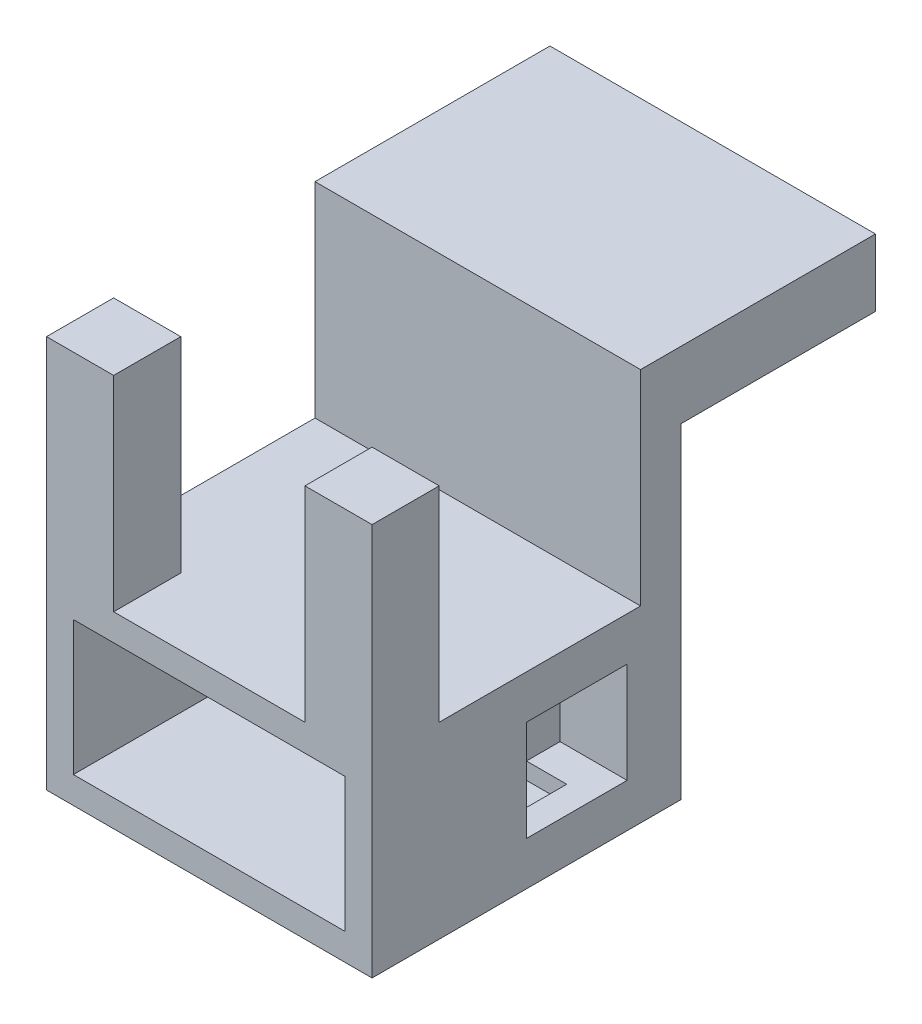
ISO-10303-21;
HEADER;
FILE_DESCRIPTION(('STEP AP214'),'2;1');
FILE_NAME('part.step','',(''),(''),'','','');
FILE_SCHEMA(('AUTOMOTIVE_DESIGN { 1 0 10303 214 1 1 1 1 }'));
ENDSEC;
DATA;
#1=APPLICATION_CONTEXT('core data for automotive mechanical design processes');
#2=APPLICATION_PROTOCOL_DEFINITION('international standard','automotive_design',2000,#1);
#3=PRODUCT_CONTEXT('',#1,'mechanical');
#4=PRODUCT('Part','Part','',(#3));
#5=PRODUCT_RELATED_PRODUCT_CATEGORY('part','',(#4));
#6=PRODUCT_DEFINITION_FORMATION('','',#4);
#7=PRODUCT_DEFINITION_CONTEXT('part definition',#1,'design');
#8=PRODUCT_DEFINITION('design','',#6,#7);
#9=PRODUCT_DEFINITION_SHAPE('','',#8);
#10=(LENGTH_UNIT() NAMED_UNIT(*) SI_UNIT(.MILLI.,.METRE.));
#11=(NAMED_UNIT(*) PLANE_ANGLE_UNIT() SI_UNIT($,.RADIAN.));
#12=(NAMED_UNIT(*) SI_UNIT($,.STERADIAN.) SOLID_ANGLE_UNIT());
#13=UNCERTAINTY_MEASURE_WITH_UNIT(LENGTH_MEASURE(1.E-05),#10,'distance_accuracy_value','');
#14=(GEOMETRIC_REPRESENTATION_CONTEXT(3) GLOBAL_UNCERTAINTY_ASSIGNED_CONTEXT((#13)) GLOBAL_UNIT_ASSIGNED_CONTEXT((#10,
#11,#12)) REPRESENTATION_CONTEXT('',''));
#15=CARTESIAN_POINT('',(0.,0.,0.));
#16=DIRECTION('',(0.,0.,1.));
#17=DIRECTION('',(1.,0.,0.));
#18=AXIS2_PLACEMENT_3D('',#15,#16,#17);
#19=CARTESIAN_POINT('',(-10.,10.,-57.55));
#20=DIRECTION('',(1.,0.,0.));
#21=DIRECTION('',(0.,1.,0.));
#22=AXIS2_PLACEMENT_3D('',#19,#20,#21);
#23=PLANE('',#22);
#24=DIRECTION('',(0.,0.,1.));
#25=VECTOR('',#24,1.);
#26=CARTESIAN_POINT('',(-10.,-10.,-57.55));
#27=LINE('',#26,#25);
#28=CARTESIAN_POINT('',(-10.,-10.,-50.55));
#29=VERTEX_POINT('',#28);
#30=CARTESIAN_POINT('',(-10.,-10.,-17.55));
#31=VERTEX_POINT('',#30);
#32=EDGE_CURVE('E360',#29,#31,#27,.T.);
#33=ORIENTED_EDGE('',*,*,#32,.F.);
#34=DIRECTION('',(0.,1.,0.));
#35=VECTOR('',#34,1.);
#36=CARTESIAN_POINT('',(-10.,10.,-50.55));
#37=LINE('',#36,#35);
#38=CARTESIAN_POINT('',(-10.,10.,-50.55));
#39=VERTEX_POINT('',#38);
#40=EDGE_CURVE('E345',#29,#39,#37,.T.);
#41=ORIENTED_EDGE('',*,*,#40,.T.);
#42=DIRECTION('',(0.,0.,1.));
#43=VECTOR('',#42,1.);
#44=CARTESIAN_POINT('',(-10.,10.,-57.55));
#45=LINE('',#44,#43);
#46=CARTESIAN_POINT('',(-10.,10.,-17.55));
#47=VERTEX_POINT('',#46);
#48=EDGE_CURVE('E220',#39,#47,#45,.T.);
#49=ORIENTED_EDGE('',*,*,#48,.T.);
#50=DIRECTION('',(0.,1.,0.));
#51=VECTOR('',#50,1.);
#52=CARTESIAN_POINT('',(-10.,10.,-17.55));
#53=LINE('',#52,#51);
#54=EDGE_CURVE('E348',#31,#47,#53,.T.);
#55=ORIENTED_EDGE('',*,*,#54,.F.);
#56=EDGE_LOOP('',(#33,#41,#49,#55));
#57=FACE_BOUND('',#56,.T.);
#58=ADVANCED_FACE('F47',(#57),#23,.T.);
#59=CARTESIAN_POINT('',(30.5,10.,-57.55));
#60=DIRECTION('',(0.,-1.,0.));
#61=DIRECTION('',(0.,0.,-1.));
#62=AXIS2_PLACEMENT_3D('',#59,#60,#61);
#63=PLANE('',#62);
#64=ORIENTED_EDGE('',*,*,#48,.F.);
#65=DIRECTION('',(1.,0.,0.));
#66=VECTOR('',#65,1.);
#67=CARTESIAN_POINT('',(30.5,10.,-50.55));
#68=LINE('',#67,#66);
#69=CARTESIAN_POINT('',(30.5,10.,-50.55));
#70=VERTEX_POINT('',#69);
#71=EDGE_CURVE('E342',#39,#70,#68,.T.);
#72=ORIENTED_EDGE('',*,*,#71,.T.);
#73=DIRECTION('',(0.,0.,1.));
#74=VECTOR('',#73,1.);
#75=CARTESIAN_POINT('',(30.5,10.,-57.55));
#76=LINE('',#75,#74);
#77=CARTESIAN_POINT('',(30.5,10.,-17.55));
#78=VERTEX_POINT('',#77);
#79=EDGE_CURVE('E364',#70,#78,#76,.T.);
#80=ORIENTED_EDGE('',*,*,#79,.T.);
#81=DIRECTION('',(1.,0.,0.));
#82=VECTOR('',#81,1.);
#83=CARTESIAN_POINT('',(30.5,10.,-17.55));
#84=LINE('',#83,#82);
#85=EDGE_CURVE('E351',#47,#78,#84,.T.);
#86=ORIENTED_EDGE('',*,*,#85,.F.);
#87=EDGE_LOOP('',(#64,#72,#80,#86));
#88=FACE_BOUND('',#87,.T.);
#89=ADVANCED_FACE('F406',(#88),#63,.T.);
#90=CARTESIAN_POINT('',(30.5,10.,-57.55));
#91=DIRECTION('',(-1.,0.,0.));
#92=DIRECTION('',(0.,-1.,0.));
#93=AXIS2_PLACEMENT_3D('',#90,#91,#92);
#94=PLANE('',#93);
#95=DIRECTION('',(0.,0.,-1.));
#96=VECTOR('',#95,1.);
#97=CARTESIAN_POINT('',(30.5,7.5,-57.55));
#98=LINE('',#97,#96);
#99=CARTESIAN_POINT('',(30.5,7.5,-40.55));
#100=VERTEX_POINT('',#99);
#101=CARTESIAN_POINT('',(30.5,7.5,-50.55));
#102=VERTEX_POINT('',#101);
#103=EDGE_CURVE('E334',#100,#102,#98,.T.);
#104=ORIENTED_EDGE('',*,*,#103,.F.);
#105=DIRECTION('',(0.,1.,0.));
#106=VECTOR('',#105,1.);
#107=CARTESIAN_POINT('',(30.5,10.,-40.55));
#108=LINE('',#107,#106);
#109=CARTESIAN_POINT('',(30.5,-7.5,-40.55));
#110=VERTEX_POINT('',#109);
#111=EDGE_CURVE('E336',#110,#100,#108,.T.);
#112=ORIENTED_EDGE('',*,*,#111,.F.);
#113=DIRECTION('',(0.,0.,1.));
#114=VECTOR('',#113,1.);
#115=CARTESIAN_POINT('',(30.5,-7.5,-57.55));
#116=LINE('',#115,#114);
#117=CARTESIAN_POINT('',(30.5,-7.5,-50.55));
#118=VERTEX_POINT('',#117);
#119=EDGE_CURVE('E326',#118,#110,#116,.T.);
#120=ORIENTED_EDGE('',*,*,#119,.F.);
#121=DIRECTION('',(0.,-1.,0.));
#122=VECTOR('',#121,1.);
#123=CARTESIAN_POINT('',(30.5,10.,-50.55));
#124=LINE('',#123,#122);
#125=CARTESIAN_POINT('',(30.5,-10.,-50.55));
#126=VERTEX_POINT('',#125);
#127=EDGE_CURVE('E338',#118,#126,#124,.T.);
#128=ORIENTED_EDGE('',*,*,#127,.T.);
#129=DIRECTION('',(0.,0.,1.));
#130=VECTOR('',#129,1.);
#131=CARTESIAN_POINT('',(30.5,-10.,-57.55));
#132=LINE('',#131,#130);
#133=CARTESIAN_POINT('',(30.5,-10.,-17.55));
#134=VERTEX_POINT('',#133);
#135=EDGE_CURVE('E362',#126,#134,#132,.T.);
#136=ORIENTED_EDGE('',*,*,#135,.T.);
#137=DIRECTION('',(0.,-1.,0.));
#138=VECTOR('',#137,1.);
#139=CARTESIAN_POINT('',(30.5,10.,-17.55));
#140=LINE('',#139,#138);
#141=EDGE_CURVE('E354',#78,#134,#140,.T.);
#142=ORIENTED_EDGE('',*,*,#141,.F.);
#143=ORIENTED_EDGE('',*,*,#79,.F.);
#144=EDGE_CURVE('E339',#70,#102,#124,.T.);
#145=ORIENTED_EDGE('',*,*,#144,.T.);
#146=EDGE_LOOP('',(#104,#112,#120,#128,#136,#142,#143,#145));
#147=FACE_BOUND('',#146,.T.);
#148=ADVANCED_FACE('F400',(#147),#94,.T.);
#149=CARTESIAN_POINT('',(30.5,-10.,-57.55));
#150=DIRECTION('',(0.,1.,0.));
#151=DIRECTION('',(0.,0.,1.));
#152=AXIS2_PLACEMENT_3D('',#149,#150,#151);
#153=PLANE('',#152);
#154=ORIENTED_EDGE('',*,*,#135,.F.);
#155=DIRECTION('',(-1.,0.,0.));
#156=VECTOR('',#155,1.);
#157=CARTESIAN_POINT('',(30.5,-10.,-50.55));
#158=LINE('',#157,#156);
#159=EDGE_CURVE('E383',#126,#29,#158,.T.);
#160=ORIENTED_EDGE('',*,*,#159,.T.);
#161=ORIENTED_EDGE('',*,*,#32,.T.);
#162=DIRECTION('',(-1.,0.,0.));
#163=VECTOR('',#162,1.);
#164=CARTESIAN_POINT('',(30.5,-10.,-17.55));
#165=LINE('',#164,#163);
#166=EDGE_CURVE('E357',#134,#31,#165,.T.);
#167=ORIENTED_EDGE('',*,*,#166,.F.);
#168=EDGE_LOOP('',(#154,#160,#161,#167));
#169=FACE_BOUND('',#168,.T.);
#170=ADVANCED_FACE('F414',(#169),#153,.T.);
#171=CARTESIAN_POINT('',(0.,0.,-17.55));
#172=DIRECTION('',(0.,0.,-1.));
#173=DIRECTION('',(-1.,0.,0.));
#174=AXIS2_PLACEMENT_3D('',#171,#172,#173);
#175=PLANE('',#174);
#176=DIRECTION('',(0.,-1.,0.));
#177=VECTOR('',#176,1.);
#178=CARTESIAN_POINT('',(34.5,14.,-17.55));
#179=LINE('',#178,#177);
#180=CARTESIAN_POINT('',(34.5,44.5,-17.55));
#181=VERTEX_POINT('',#180);
#182=CARTESIAN_POINT('',(34.5,-14.,-17.55));
#183=VERTEX_POINT('',#182);
#184=EDGE_CURVE('E209',#181,#183,#179,.T.);
#185=ORIENTED_EDGE('',*,*,#184,.F.);
#186=DIRECTION('',(-1.,0.,0.));
#187=VECTOR('',#186,1.);
#188=CARTESIAN_POINT('',(34.5,44.5,-17.55));
#189=LINE('',#188,#187);
#190=CARTESIAN_POINT('',(24.5,44.5,-17.55));
#191=VERTEX_POINT('',#190);
#192=EDGE_CURVE('E213',#181,#191,#189,.T.);
#193=ORIENTED_EDGE('',*,*,#192,.T.);
#194=DIRECTION('',(0.,-1.,0.));
#195=VECTOR('',#194,1.);
#196=CARTESIAN_POINT('',(24.5,58.642135623731,-17.55));
#197=LINE('',#196,#195);
#198=CARTESIAN_POINT('',(24.5,14.,-17.55));
#199=VERTEX_POINT('',#198);
#200=EDGE_CURVE('E230',#191,#199,#197,.T.);
#201=ORIENTED_EDGE('',*,*,#200,.T.);
#202=DIRECTION('',(1.,0.,0.));
#203=VECTOR('',#202,1.);
#204=CARTESIAN_POINT('',(34.5,14.,-17.55));
#205=LINE('',#204,#203);
#206=CARTESIAN_POINT('',(-3.99999999999999,14.,-17.55));
#207=VERTEX_POINT('',#206);
#208=EDGE_CURVE('E370',#207,#199,#205,.T.);
#209=ORIENTED_EDGE('',*,*,#208,.F.);
#210=DIRECTION('',(0.,-1.,0.));
#211=VECTOR('',#210,1.);
#212=CARTESIAN_POINT('',(-4.,58.642135623731,-17.55));
#213=LINE('',#212,#211);
#214=CARTESIAN_POINT('',(-4.,44.5,-17.55));
#215=VERTEX_POINT('',#214);
#216=EDGE_CURVE('E259',#215,#207,#213,.T.);
#217=ORIENTED_EDGE('',*,*,#216,.F.);
#218=DIRECTION('',(-1.,0.,0.));
#219=VECTOR('',#218,1.);
#220=CARTESIAN_POINT('',(-14.,44.5,-17.55));
#221=LINE('',#220,#219);
#222=CARTESIAN_POINT('',(-14.,44.5,-17.55));
#223=VERTEX_POINT('',#222);
#224=EDGE_CURVE('E256',#215,#223,#221,.T.);
#225=ORIENTED_EDGE('',*,*,#224,.T.);
#226=DIRECTION('',(0.,1.,0.));
#227=VECTOR('',#226,1.);
#228=CARTESIAN_POINT('',(-14.,14.,-17.55));
#229=LINE('',#228,#227);
#230=CARTESIAN_POINT('',(-14.,-14.,-17.55));
#231=VERTEX_POINT('',#230);
#232=EDGE_CURVE('E373',#231,#223,#229,.T.);
#233=ORIENTED_EDGE('',*,*,#232,.F.);
#234=DIRECTION('',(-1.,0.,0.));
#235=VECTOR('',#234,1.);
#236=CARTESIAN_POINT('',(34.5,-14.,-17.55));
#237=LINE('',#236,#235);
#238=EDGE_CURVE('E216',#183,#231,#237,.T.);
#239=ORIENTED_EDGE('',*,*,#238,.F.);
#240=EDGE_LOOP('',(#185,#193,#201,#209,#217,#225,#233,#239));
#241=FACE_BOUND('',#240,.T.);
#242=ORIENTED_EDGE('',*,*,#54,.T.);
#243=ORIENTED_EDGE('',*,*,#85,.T.);
#244=ORIENTED_EDGE('',*,*,#141,.T.);
#245=ORIENTED_EDGE('',*,*,#166,.T.);
#246=EDGE_LOOP('',(#242,#243,#244,#245));
#247=FACE_BOUND('',#246,.T.);
#248=ADVANCED_FACE('F211',(#241,#247),#175,.F.);
#249=CARTESIAN_POINT('',(34.5,14.,-57.55));
#250=DIRECTION('',(-1.,0.,0.));
#251=DIRECTION('',(0.,0.,1.));
#252=AXIS2_PLACEMENT_3D('',#249,#250,#251);
#253=PLANE('',#252);
#254=DIRECTION('',(0.,0.,-1.));
#255=VECTOR('',#254,1.);
#256=CARTESIAN_POINT('',(34.5,-7.5,-40.55));
#257=LINE('',#256,#255);
#258=CARTESIAN_POINT('',(34.5,-7.5,-40.55));
#259=VERTEX_POINT('',#258);
#260=CARTESIAN_POINT('',(34.5,-7.5,-55.55));
#261=VERTEX_POINT('',#260);
#262=EDGE_CURVE('E316',#259,#261,#257,.T.);
#263=ORIENTED_EDGE('',*,*,#262,.F.);
#264=DIRECTION('',(0.,-1.,0.));
#265=VECTOR('',#264,1.);
#266=CARTESIAN_POINT('',(34.5,7.5,-40.55));
#267=LINE('',#266,#265);
#268=CARTESIAN_POINT('',(34.5,7.5,-40.55));
#269=VERTEX_POINT('',#268);
#270=EDGE_CURVE('E305',#269,#259,#267,.T.);
#271=ORIENTED_EDGE('',*,*,#270,.F.);
#272=DIRECTION('',(0.,0.,1.));
#273=VECTOR('',#272,1.);
#274=CARTESIAN_POINT('',(34.5,7.5,-40.55));
#275=LINE('',#274,#273);
#276=CARTESIAN_POINT('',(34.5,7.5,-55.55));
#277=VERTEX_POINT('',#276);
#278=EDGE_CURVE('E309',#277,#269,#275,.T.);
#279=ORIENTED_EDGE('',*,*,#278,.F.);
#280=DIRECTION('',(0.,1.,0.));
#281=VECTOR('',#280,1.);
#282=CARTESIAN_POINT('',(34.5,7.5,-55.55));
#283=LINE('',#282,#281);
#284=EDGE_CURVE('E319',#261,#277,#283,.T.);
#285=ORIENTED_EDGE('',*,*,#284,.F.);
#286=EDGE_LOOP('',(#263,#271,#279,#285));
#287=FACE_BOUND('',#286,.T.);
#288=DIRECTION('',(0.,-1.,0.));
#289=VECTOR('',#288,1.);
#290=CARTESIAN_POINT('',(34.5,0.,-63.55));
#291=LINE('',#290,#289);
#292=CARTESIAN_POINT('',(34.5,34.5,-63.55));
#293=VERTEX_POINT('',#292);
#294=CARTESIAN_POINT('',(34.5,-14.,-63.55));
#295=VERTEX_POINT('',#294);
#296=EDGE_CURVE('E289',#293,#295,#291,.T.);
#297=ORIENTED_EDGE('',*,*,#296,.F.);
#298=DIRECTION('',(0.,0.,1.));
#299=VECTOR('',#298,1.);
#300=CARTESIAN_POINT('',(34.5,34.5,-92.55));
#301=LINE('',#300,#299);
#302=CARTESIAN_POINT('',(34.5,34.5,-92.55));
#303=VERTEX_POINT('',#302);
#304=EDGE_CURVE('E280',#303,#293,#301,.T.);
#305=ORIENTED_EDGE('',*,*,#304,.F.);
#306=DIRECTION('',(0.,1.,0.));
#307=VECTOR('',#306,1.);
#308=CARTESIAN_POINT('',(34.5,0.,-92.55));
#309=LINE('',#308,#307);
#310=CARTESIAN_POINT('',(34.5,44.5,-92.55));
#311=VERTEX_POINT('',#310);
#312=EDGE_CURVE('E277',#303,#311,#309,.T.);
#313=ORIENTED_EDGE('',*,*,#312,.T.);
#314=DIRECTION('',(0.,0.,1.));
#315=VECTOR('',#314,1.);
#316=CARTESIAN_POINT('',(34.5,44.5,-63.55));
#317=LINE('',#316,#315);
#318=CARTESIAN_POINT('',(34.5,44.5,-57.55));
#319=VERTEX_POINT('',#318);
#320=EDGE_CURVE('E295',#311,#319,#317,.T.);
#321=ORIENTED_EDGE('',*,*,#320,.T.);
#322=DIRECTION('',(0.,-1.,0.));
#323=VECTOR('',#322,1.);
#324=CARTESIAN_POINT('',(34.5,0.,-57.55));
#325=LINE('',#324,#323);
#326=CARTESIAN_POINT('',(34.5,14.,-57.55));
#327=VERTEX_POINT('',#326);
#328=EDGE_CURVE('E290',#319,#327,#325,.T.);
#329=ORIENTED_EDGE('',*,*,#328,.T.);
#330=DIRECTION('',(0.,0.,1.));
#331=VECTOR('',#330,1.);
#332=CARTESIAN_POINT('',(34.5,14.,-57.55));
#333=LINE('',#332,#331);
#334=CARTESIAN_POINT('',(34.5,14.,-27.55));
#335=VERTEX_POINT('',#334);
#336=EDGE_CURVE('E369',#327,#335,#333,.T.);
#337=ORIENTED_EDGE('',*,*,#336,.T.);
#338=DIRECTION('',(0.,-1.,0.));
#339=VECTOR('',#338,1.);
#340=CARTESIAN_POINT('',(34.5,58.642135623731,-27.55));
#341=LINE('',#340,#339);
#342=CARTESIAN_POINT('',(34.5,44.5,-27.55));
#343=VERTEX_POINT('',#342);
#344=EDGE_CURVE('E233',#343,#335,#341,.T.);
#345=ORIENTED_EDGE('',*,*,#344,.F.);
#346=DIRECTION('',(0.,0.,1.));
#347=VECTOR('',#346,1.);
#348=CARTESIAN_POINT('',(34.5,44.5,-17.55));
#349=LINE('',#348,#347);
#350=EDGE_CURVE('E224',#343,#181,#349,.T.);
#351=ORIENTED_EDGE('',*,*,#350,.T.);
#352=ORIENTED_EDGE('',*,*,#184,.T.);
#353=DIRECTION('',(0.,0.,1.));
#354=VECTOR('',#353,1.);
#355=CARTESIAN_POINT('',(34.5,-14.,-57.55));
#356=LINE('',#355,#354);
#357=EDGE_CURVE('E381',#295,#183,#356,.T.);
#358=ORIENTED_EDGE('',*,*,#357,.F.);
#359=EDGE_LOOP('',(#297,#305,#313,#321,#329,#337,#345,#351,#352,#358));
#360=FACE_BOUND('',#359,.T.);
#361=ADVANCED_FACE('F49',(#287,#360),#253,.F.);
#362=CARTESIAN_POINT('',(34.5,-14.,-57.55));
#363=DIRECTION('',(0.,1.,0.));
#364=DIRECTION('',(-1.,0.,0.));
#365=AXIS2_PLACEMENT_3D('',#362,#363,#364);
#366=PLANE('',#365);
#367=ORIENTED_EDGE('',*,*,#357,.T.);
#368=ORIENTED_EDGE('',*,*,#238,.T.);
#369=DIRECTION('',(0.,0.,1.));
#370=VECTOR('',#369,1.);
#371=CARTESIAN_POINT('',(-14.,-14.,-57.55));
#372=LINE('',#371,#370);
#373=CARTESIAN_POINT('',(-14.,-14.,-63.55));
#374=VERTEX_POINT('',#373);
#375=EDGE_CURVE('E379',#374,#231,#372,.T.);
#376=ORIENTED_EDGE('',*,*,#375,.F.);
#377=DIRECTION('',(-1.,0.,0.));
#378=VECTOR('',#377,1.);
#379=CARTESIAN_POINT('',(0.,-14.,-63.55));
#380=LINE('',#379,#378);
#381=EDGE_CURVE('E292',#295,#374,#380,.T.);
#382=ORIENTED_EDGE('',*,*,#381,.F.);
#383=EDGE_LOOP('',(#367,#368,#376,#382));
#384=FACE_BOUND('',#383,.T.);
#385=ADVANCED_FACE('F460',(#384),#366,.F.);
#386=CARTESIAN_POINT('',(-14.,14.,-57.55));
#387=DIRECTION('',(1.,0.,0.));
#388=DIRECTION('',(0.,1.,0.));
#389=AXIS2_PLACEMENT_3D('',#386,#387,#388);
#390=PLANE('',#389);
#391=DIRECTION('',(0.,1.,0.));
#392=VECTOR('',#391,1.);
#393=CARTESIAN_POINT('',(-14.,0.,-57.55));
#394=LINE('',#393,#392);
#395=CARTESIAN_POINT('',(-14.,14.,-57.55));
#396=VERTEX_POINT('',#395);
#397=CARTESIAN_POINT('',(-14.,44.5,-57.55));
#398=VERTEX_POINT('',#397);
#399=EDGE_CURVE('E286',#396,#398,#394,.T.);
#400=ORIENTED_EDGE('',*,*,#399,.T.);
#401=DIRECTION('',(0.,0.,1.));
#402=VECTOR('',#401,1.);
#403=CARTESIAN_POINT('',(-14.,44.5,-63.55));
#404=LINE('',#403,#402);
#405=CARTESIAN_POINT('',(-14.,44.5,-92.55));
#406=VERTEX_POINT('',#405);
#407=EDGE_CURVE('E302',#406,#398,#404,.T.);
#408=ORIENTED_EDGE('',*,*,#407,.F.);
#409=DIRECTION('',(0.,1.,0.));
#410=VECTOR('',#409,1.);
#411=CARTESIAN_POINT('',(-14.,0.,-92.55));
#412=LINE('',#411,#410);
#413=CARTESIAN_POINT('',(-14.,34.5,-92.55));
#414=VERTEX_POINT('',#413);
#415=EDGE_CURVE('E271',#414,#406,#412,.T.);
#416=ORIENTED_EDGE('',*,*,#415,.F.);
#417=DIRECTION('',(0.,0.,1.));
#418=VECTOR('',#417,1.);
#419=CARTESIAN_POINT('',(-14.,34.5,-92.55));
#420=LINE('',#419,#418);
#421=CARTESIAN_POINT('',(-14.,34.5,-63.55));
#422=VERTEX_POINT('',#421);
#423=EDGE_CURVE('E283',#414,#422,#420,.T.);
#424=ORIENTED_EDGE('',*,*,#423,.T.);
#425=DIRECTION('',(0.,1.,0.));
#426=VECTOR('',#425,1.);
#427=CARTESIAN_POINT('',(-14.,0.,-63.55));
#428=LINE('',#427,#426);
#429=EDGE_CURVE('E287',#374,#422,#428,.T.);
#430=ORIENTED_EDGE('',*,*,#429,.F.);
#431=ORIENTED_EDGE('',*,*,#375,.T.);
#432=ORIENTED_EDGE('',*,*,#232,.T.);
#433=DIRECTION('',(0.,0.,-1.));
#434=VECTOR('',#433,1.);
#435=CARTESIAN_POINT('',(-14.,44.5,-17.55));
#436=LINE('',#435,#434);
#437=CARTESIAN_POINT('',(-14.,44.5,-27.55));
#438=VERTEX_POINT('',#437);
#439=EDGE_CURVE('E252',#223,#438,#436,.T.);
#440=ORIENTED_EDGE('',*,*,#439,.T.);
#441=DIRECTION('',(0.,-1.,0.));
#442=VECTOR('',#441,1.);
#443=CARTESIAN_POINT('',(-14.,58.642135623731,-27.55));
#444=LINE('',#443,#442);
#445=CARTESIAN_POINT('',(-14.,14.,-27.55));
#446=VERTEX_POINT('',#445);
#447=EDGE_CURVE('E255',#438,#446,#444,.T.);
#448=ORIENTED_EDGE('',*,*,#447,.T.);
#449=DIRECTION('',(0.,0.,1.));
#450=VECTOR('',#449,1.);
#451=CARTESIAN_POINT('',(-14.,14.,-57.55));
#452=LINE('',#451,#450);
#453=EDGE_CURVE('E377',#396,#446,#452,.T.);
#454=ORIENTED_EDGE('',*,*,#453,.F.);
#455=EDGE_LOOP('',(#400,#408,#416,#424,#430,#431,#432,#440,#448,#454));
#456=FACE_BOUND('',#455,.T.);
#457=ADVANCED_FACE('F458',(#456),#390,.F.);
#458=CARTESIAN_POINT('',(34.5,14.,-57.55));
#459=DIRECTION('',(0.,-1.,0.));
#460=DIRECTION('',(0.,0.,-1.));
#461=AXIS2_PLACEMENT_3D('',#458,#459,#460);
#462=PLANE('',#461);
#463=ORIENTED_EDGE('',*,*,#208,.T.);
#464=DIRECTION('',(0.,0.,-1.));
#465=VECTOR('',#464,1.);
#466=CARTESIAN_POINT('',(24.5,14.,-17.55));
#467=LINE('',#466,#465);
#468=CARTESIAN_POINT('',(24.5,14.,-27.55));
#469=VERTEX_POINT('',#468);
#470=EDGE_CURVE('E241',#199,#469,#467,.T.);
#471=ORIENTED_EDGE('',*,*,#470,.T.);
#472=DIRECTION('',(1.,0.,0.));
#473=VECTOR('',#472,1.);
#474=CARTESIAN_POINT('',(34.5,14.,-27.55));
#475=LINE('',#474,#473);
#476=EDGE_CURVE('E229',#469,#335,#475,.T.);
#477=ORIENTED_EDGE('',*,*,#476,.T.);
#478=ORIENTED_EDGE('',*,*,#336,.F.);
#479=DIRECTION('',(1.,0.,0.));
#480=VECTOR('',#479,1.);
#481=CARTESIAN_POINT('',(34.5,14.,-57.55));
#482=LINE('',#481,#480);
#483=EDGE_CURVE('E367',#396,#327,#482,.T.);
#484=ORIENTED_EDGE('',*,*,#483,.F.);
#485=ORIENTED_EDGE('',*,*,#453,.T.);
#486=DIRECTION('',(1.,0.,0.));
#487=VECTOR('',#486,1.);
#488=CARTESIAN_POINT('',(-14.,14.,-27.55));
#489=LINE('',#488,#487);
#490=CARTESIAN_POINT('',(-4.,14.,-27.55));
#491=VERTEX_POINT('',#490);
#492=EDGE_CURVE('E62',#446,#491,#489,.T.);
#493=ORIENTED_EDGE('',*,*,#492,.T.);
#494=DIRECTION('',(0.,0.,1.));
#495=VECTOR('',#494,1.);
#496=CARTESIAN_POINT('',(-4.,14.,-17.55));
#497=LINE('',#496,#495);
#498=EDGE_CURVE('E67',#491,#207,#497,.T.);
#499=ORIENTED_EDGE('',*,*,#498,.T.);
#500=EDGE_LOOP('',(#463,#471,#477,#478,#484,#485,#493,#499));
#501=FACE_BOUND('',#500,.T.);
#502=ADVANCED_FACE('F455',(#501),#462,.F.);
#503=CARTESIAN_POINT('',(0.,0.,-50.55));
#504=DIRECTION('',(0.,0.,-1.));
#505=DIRECTION('',(-1.,0.,0.));
#506=AXIS2_PLACEMENT_3D('',#503,#504,#505);
#507=PLANE('',#506);
#508=DIRECTION('',(0.,-1.,0.));
#509=VECTOR('',#508,1.);
#510=CARTESIAN_POINT('',(24.5,0.,-50.55));
#511=LINE('',#510,#509);
#512=CARTESIAN_POINT('',(24.5,7.5,-50.55));
#513=VERTEX_POINT('',#512);
#514=CARTESIAN_POINT('',(24.5,-7.5,-50.55));
#515=VERTEX_POINT('',#514);
#516=EDGE_CURVE('E386',#513,#515,#511,.T.);
#517=ORIENTED_EDGE('',*,*,#516,.F.);
#518=DIRECTION('',(1.,0.,0.));
#519=VECTOR('',#518,1.);
#520=CARTESIAN_POINT('',(0.,7.5,-50.55));
#521=LINE('',#520,#519);
#522=EDGE_CURVE('E55',#513,#102,#521,.T.);
#523=ORIENTED_EDGE('',*,*,#522,.T.);
#524=ORIENTED_EDGE('',*,*,#144,.F.);
#525=ORIENTED_EDGE('',*,*,#71,.F.);
#526=ORIENTED_EDGE('',*,*,#40,.F.);
#527=ORIENTED_EDGE('',*,*,#159,.F.);
#528=ORIENTED_EDGE('',*,*,#127,.F.);
#529=DIRECTION('',(-1.,0.,0.));
#530=VECTOR('',#529,1.);
#531=CARTESIAN_POINT('',(0.,-7.5,-50.55));
#532=LINE('',#531,#530);
#533=EDGE_CURVE('E388',#118,#515,#532,.T.);
#534=ORIENTED_EDGE('',*,*,#533,.T.);
#535=EDGE_LOOP('',(#517,#523,#524,#525,#526,#527,#528,#534));
#536=FACE_BOUND('',#535,.T.);
#537=ADVANCED_FACE('F394',(#536),#507,.F.);
#538=CARTESIAN_POINT('',(24.5,0.,0.));
#539=DIRECTION('',(1.,0.,0.));
#540=DIRECTION('',(0.,0.,-1.));
#541=AXIS2_PLACEMENT_3D('',#538,#539,#540);
#542=PLANE('',#541);
#543=ORIENTED_EDGE('',*,*,#516,.T.);
#544=DIRECTION('',(0.,0.,-1.));
#545=VECTOR('',#544,1.);
#546=CARTESIAN_POINT('',(24.5,-7.5,-40.55));
#547=LINE('',#546,#545);
#548=CARTESIAN_POINT('',(24.5,-7.5,-55.55));
#549=VERTEX_POINT('',#548);
#550=EDGE_CURVE('E306',#515,#549,#547,.T.);
#551=ORIENTED_EDGE('',*,*,#550,.T.);
#552=DIRECTION('',(0.,1.,0.));
#553=VECTOR('',#552,1.);
#554=CARTESIAN_POINT('',(24.5,7.5,-55.55));
#555=LINE('',#554,#553);
#556=CARTESIAN_POINT('',(24.5,7.5,-55.55));
#557=VERTEX_POINT('',#556);
#558=EDGE_CURVE('E308',#549,#557,#555,.T.);
#559=ORIENTED_EDGE('',*,*,#558,.T.);
#560=DIRECTION('',(0.,0.,1.));
#561=VECTOR('',#560,1.);
#562=CARTESIAN_POINT('',(24.5,7.5,-40.55));
#563=LINE('',#562,#561);
#564=EDGE_CURVE('E312',#557,#513,#563,.T.);
#565=ORIENTED_EDGE('',*,*,#564,.T.);
#566=EDGE_LOOP('',(#543,#551,#559,#565));
#567=FACE_BOUND('',#566,.T.);
#568=ADVANCED_FACE('F434',(#567),#542,.T.);
#569=CARTESIAN_POINT('',(24.5,7.5,-40.55));
#570=DIRECTION('',(0.,0.,1.));
#571=DIRECTION('',(1.,0.,0.));
#572=AXIS2_PLACEMENT_3D('',#569,#570,#571);
#573=PLANE('',#572);
#574=ORIENTED_EDGE('',*,*,#111,.T.);
#575=DIRECTION('',(1.,0.,0.));
#576=VECTOR('',#575,1.);
#577=CARTESIAN_POINT('',(24.5,7.5,-40.55));
#578=LINE('',#577,#576);
#579=EDGE_CURVE('E324',#100,#269,#578,.T.);
#580=ORIENTED_EDGE('',*,*,#579,.T.);
#581=ORIENTED_EDGE('',*,*,#270,.T.);
#582=DIRECTION('',(1.,0.,0.));
#583=VECTOR('',#582,1.);
#584=CARTESIAN_POINT('',(24.5,-7.5,-40.55));
#585=LINE('',#584,#583);
#586=EDGE_CURVE('E314',#110,#259,#585,.T.);
#587=ORIENTED_EDGE('',*,*,#586,.F.);
#588=EDGE_LOOP('',(#574,#580,#581,#587));
#589=FACE_BOUND('',#588,.T.);
#590=ADVANCED_FACE('F423',(#589),#573,.F.);
#591=CARTESIAN_POINT('',(24.5,7.5,-40.55));
#592=DIRECTION('',(0.,1.,0.));
#593=DIRECTION('',(0.,0.,1.));
#594=AXIS2_PLACEMENT_3D('',#591,#592,#593);
#595=PLANE('',#594);
#596=ORIENTED_EDGE('',*,*,#103,.T.);
#597=ORIENTED_EDGE('',*,*,#522,.F.);
#598=ORIENTED_EDGE('',*,*,#564,.F.);
#599=DIRECTION('',(1.,0.,0.));
#600=VECTOR('',#599,1.);
#601=CARTESIAN_POINT('',(24.5,7.5,-55.55));
#602=LINE('',#601,#600);
#603=EDGE_CURVE('E327',#557,#277,#602,.T.);
#604=ORIENTED_EDGE('',*,*,#603,.T.);
#605=ORIENTED_EDGE('',*,*,#278,.T.);
#606=ORIENTED_EDGE('',*,*,#579,.F.);
#607=EDGE_LOOP('',(#596,#597,#598,#604,#605,#606));
#608=FACE_BOUND('',#607,.T.);
#609=ADVANCED_FACE('F435',(#608),#595,.F.);
#610=CARTESIAN_POINT('',(24.5,7.5,-55.55));
#611=DIRECTION('',(0.,0.,-1.));
#612=DIRECTION('',(-1.,0.,0.));
#613=AXIS2_PLACEMENT_3D('',#610,#611,#612);
#614=PLANE('',#613);
#615=ORIENTED_EDGE('',*,*,#284,.T.);
#616=ORIENTED_EDGE('',*,*,#603,.F.);
#617=ORIENTED_EDGE('',*,*,#558,.F.);
#618=DIRECTION('',(1.,0.,0.));
#619=VECTOR('',#618,1.);
#620=CARTESIAN_POINT('',(24.5,-7.5,-55.55));
#621=LINE('',#620,#619);
#622=EDGE_CURVE('E329',#549,#261,#621,.T.);
#623=ORIENTED_EDGE('',*,*,#622,.T.);
#624=EDGE_LOOP('',(#615,#616,#617,#623));
#625=FACE_BOUND('',#624,.T.);
#626=ADVANCED_FACE('F432',(#625),#614,.F.);
#627=CARTESIAN_POINT('',(24.5,-7.5,-40.55));
#628=DIRECTION('',(0.,-1.,0.));
#629=DIRECTION('',(0.,0.,-1.));
#630=AXIS2_PLACEMENT_3D('',#627,#628,#629);
#631=PLANE('',#630);
#632=ORIENTED_EDGE('',*,*,#119,.T.);
#633=ORIENTED_EDGE('',*,*,#586,.T.);
#634=ORIENTED_EDGE('',*,*,#262,.T.);
#635=ORIENTED_EDGE('',*,*,#622,.F.);
#636=ORIENTED_EDGE('',*,*,#550,.F.);
#637=ORIENTED_EDGE('',*,*,#533,.F.);
#638=EDGE_LOOP('',(#632,#633,#634,#635,#636,#637));
#639=FACE_BOUND('',#638,.T.);
#640=ADVANCED_FACE('F419',(#639),#631,.F.);
#641=CARTESIAN_POINT('',(0.,0.,-57.55));
#642=DIRECTION('',(0.,0.,-1.));
#643=DIRECTION('',(-1.,0.,0.));
#644=AXIS2_PLACEMENT_3D('',#641,#642,#643);
#645=PLANE('',#644);
#646=ORIENTED_EDGE('',*,*,#483,.T.);
#647=ORIENTED_EDGE('',*,*,#328,.F.);
#648=DIRECTION('',(-1.,0.,0.));
#649=VECTOR('',#648,1.);
#650=CARTESIAN_POINT('',(0.,44.5,-57.55));
#651=LINE('',#650,#649);
#652=EDGE_CURVE('E297',#319,#398,#651,.T.);
#653=ORIENTED_EDGE('',*,*,#652,.T.);
#654=ORIENTED_EDGE('',*,*,#399,.F.);
#655=EDGE_LOOP('',(#646,#647,#653,#654));
#656=FACE_BOUND('',#655,.T.);
#657=ADVANCED_FACE('F487',(#656),#645,.F.);
#658=CARTESIAN_POINT('',(0.,44.5,-63.55));
#659=DIRECTION('',(0.,1.,0.));
#660=DIRECTION('',(0.,0.,1.));
#661=AXIS2_PLACEMENT_3D('',#658,#659,#660);
#662=PLANE('',#661);
#663=ORIENTED_EDGE('',*,*,#652,.F.);
#664=ORIENTED_EDGE('',*,*,#320,.F.);
#665=DIRECTION('',(-1.,0.,0.));
#666=VECTOR('',#665,1.);
#667=CARTESIAN_POINT('',(0.,44.5,-92.55));
#668=LINE('',#667,#666);
#669=EDGE_CURVE('E274',#311,#406,#668,.T.);
#670=ORIENTED_EDGE('',*,*,#669,.T.);
#671=ORIENTED_EDGE('',*,*,#407,.T.);
#672=EDGE_LOOP('',(#663,#664,#670,#671));
#673=FACE_BOUND('',#672,.T.);
#674=ADVANCED_FACE('F490',(#673),#662,.T.);
#675=CARTESIAN_POINT('',(0.,0.,-63.55));
#676=DIRECTION('',(0.,0.,-1.));
#677=DIRECTION('',(-1.,0.,0.));
#678=AXIS2_PLACEMENT_3D('',#675,#676,#677);
#679=PLANE('',#678);
#680=DIRECTION('',(-1.,0.,0.));
#681=VECTOR('',#680,1.);
#682=CARTESIAN_POINT('',(0.,34.5,-63.55));
#683=LINE('',#682,#681);
#684=EDGE_CURVE('E11',#293,#422,#683,.T.);
#685=ORIENTED_EDGE('',*,*,#684,.F.);
#686=ORIENTED_EDGE('',*,*,#296,.T.);
#687=ORIENTED_EDGE('',*,*,#381,.T.);
#688=ORIENTED_EDGE('',*,*,#429,.T.);
#689=EDGE_LOOP('',(#685,#686,#687,#688));
#690=FACE_BOUND('',#689,.T.);
#691=ADVANCED_FACE('F472',(#690),#679,.T.);
#692=CARTESIAN_POINT('',(0.,34.5,-92.55));
#693=DIRECTION('',(0.,-1.,0.));
#694=DIRECTION('',(1.,0.,0.));
#695=AXIS2_PLACEMENT_3D('',#692,#693,#694);
#696=PLANE('',#695);
#697=ORIENTED_EDGE('',*,*,#304,.T.);
#698=ORIENTED_EDGE('',*,*,#684,.T.);
#699=ORIENTED_EDGE('',*,*,#423,.F.);
#700=DIRECTION('',(1.,0.,0.));
#701=VECTOR('',#700,1.);
#702=CARTESIAN_POINT('',(0.,34.5,-92.55));
#703=LINE('',#702,#701);
#704=EDGE_CURVE('E268',#414,#303,#703,.T.);
#705=ORIENTED_EDGE('',*,*,#704,.T.);
#706=EDGE_LOOP('',(#697,#698,#699,#705));
#707=FACE_BOUND('',#706,.T.);
#708=ADVANCED_FACE('F475',(#707),#696,.T.);
#709=CARTESIAN_POINT('',(0.,0.,-92.55));
#710=DIRECTION('',(0.,0.,-1.));
#711=DIRECTION('',(-1.,0.,0.));
#712=AXIS2_PLACEMENT_3D('',#709,#710,#711);
#713=PLANE('',#712);
#714=ORIENTED_EDGE('',*,*,#704,.F.);
#715=ORIENTED_EDGE('',*,*,#415,.T.);
#716=ORIENTED_EDGE('',*,*,#669,.F.);
#717=ORIENTED_EDGE('',*,*,#312,.F.);
#718=EDGE_LOOP('',(#714,#715,#716,#717));
#719=FACE_BOUND('',#718,.T.);
#720=ADVANCED_FACE('F481',(#719),#713,.T.);
#721=CARTESIAN_POINT('',(0.,44.5,-63.55));
#722=DIRECTION('',(0.,1.,0.));
#723=DIRECTION('',(0.,0.,1.));
#724=AXIS2_PLACEMENT_3D('',#721,#722,#723);
#725=PLANE('',#724);
#726=ORIENTED_EDGE('',*,*,#439,.F.);
#727=ORIENTED_EDGE('',*,*,#224,.F.);
#728=DIRECTION('',(0.,0.,1.));
#729=VECTOR('',#728,1.);
#730=CARTESIAN_POINT('',(-4.,44.5,-17.55));
#731=LINE('',#730,#729);
#732=CARTESIAN_POINT('',(-4.,44.5,-27.55));
#733=VERTEX_POINT('',#732);
#734=EDGE_CURVE('E260',#733,#215,#731,.T.);
#735=ORIENTED_EDGE('',*,*,#734,.F.);
#736=DIRECTION('',(1.,0.,0.));
#737=VECTOR('',#736,1.);
#738=CARTESIAN_POINT('',(-14.,44.5,-27.55));
#739=LINE('',#738,#737);
#740=EDGE_CURVE('E247',#438,#733,#739,.T.);
#741=ORIENTED_EDGE('',*,*,#740,.F.);
#742=EDGE_LOOP('',(#726,#727,#735,#741));
#743=FACE_BOUND('',#742,.T.);
#744=ADVANCED_FACE('F519',(#743),#725,.T.);
#745=CARTESIAN_POINT('',(-14.,58.642135623731,-27.55));
#746=DIRECTION('',(0.,0.,-1.));
#747=DIRECTION('',(-1.,0.,0.));
#748=AXIS2_PLACEMENT_3D('',#745,#746,#747);
#749=PLANE('',#748);
#750=ORIENTED_EDGE('',*,*,#447,.F.);
#751=ORIENTED_EDGE('',*,*,#740,.T.);
#752=DIRECTION('',(0.,-1.,0.));
#753=VECTOR('',#752,1.);
#754=CARTESIAN_POINT('',(-4.,58.642135623731,-27.55));
#755=LINE('',#754,#753);
#756=EDGE_CURVE('E251',#733,#491,#755,.T.);
#757=ORIENTED_EDGE('',*,*,#756,.T.);
#758=ORIENTED_EDGE('',*,*,#492,.F.);
#759=EDGE_LOOP('',(#750,#751,#757,#758));
#760=FACE_BOUND('',#759,.T.);
#761=ADVANCED_FACE('F515',(#760),#749,.T.);
#762=CARTESIAN_POINT('',(-4.,58.642135623731,-17.55));
#763=DIRECTION('',(1.,0.,0.));
#764=DIRECTION('',(0.,0.,-1.));
#765=AXIS2_PLACEMENT_3D('',#762,#763,#764);
#766=PLANE('',#765);
#767=ORIENTED_EDGE('',*,*,#756,.F.);
#768=ORIENTED_EDGE('',*,*,#734,.T.);
#769=ORIENTED_EDGE('',*,*,#216,.T.);
#770=ORIENTED_EDGE('',*,*,#498,.F.);
#771=EDGE_LOOP('',(#767,#768,#769,#770));
#772=FACE_BOUND('',#771,.T.);
#773=ADVANCED_FACE('F510',(#772),#766,.T.);
#774=CARTESIAN_POINT('',(0.,44.5,-63.55));
#775=DIRECTION('',(0.,1.,0.));
#776=DIRECTION('',(0.,0.,1.));
#777=AXIS2_PLACEMENT_3D('',#774,#775,#776);
#778=PLANE('',#777);
#779=ORIENTED_EDGE('',*,*,#350,.F.);
#780=DIRECTION('',(1.,0.,0.));
#781=VECTOR('',#780,1.);
#782=CARTESIAN_POINT('',(34.5,44.5,-27.55));
#783=LINE('',#782,#781);
#784=CARTESIAN_POINT('',(24.5,44.5,-27.55));
#785=VERTEX_POINT('',#784);
#786=EDGE_CURVE('E236',#785,#343,#783,.T.);
#787=ORIENTED_EDGE('',*,*,#786,.F.);
#788=DIRECTION('',(0.,0.,-1.));
#789=VECTOR('',#788,1.);
#790=CARTESIAN_POINT('',(24.5,44.5,-17.55));
#791=LINE('',#790,#789);
#792=EDGE_CURVE('E227',#191,#785,#791,.T.);
#793=ORIENTED_EDGE('',*,*,#792,.F.);
#794=ORIENTED_EDGE('',*,*,#192,.F.);
#795=EDGE_LOOP('',(#779,#787,#793,#794));
#796=FACE_BOUND('',#795,.T.);
#797=ADVANCED_FACE('F223',(#796),#778,.T.);
#798=CARTESIAN_POINT('',(24.5,58.642135623731,-17.55));
#799=DIRECTION('',(-1.,0.,0.));
#800=DIRECTION('',(0.,0.,1.));
#801=AXIS2_PLACEMENT_3D('',#798,#799,#800);
#802=PLANE('',#801);
#803=ORIENTED_EDGE('',*,*,#200,.F.);
#804=ORIENTED_EDGE('',*,*,#792,.T.);
#805=DIRECTION('',(0.,-1.,0.));
#806=VECTOR('',#805,1.);
#807=CARTESIAN_POINT('',(24.5,58.642135623731,-27.55));
#808=LINE('',#807,#806);
#809=EDGE_CURVE('E497',#785,#469,#808,.T.);
#810=ORIENTED_EDGE('',*,*,#809,.T.);
#811=ORIENTED_EDGE('',*,*,#470,.F.);
#812=EDGE_LOOP('',(#803,#804,#810,#811));
#813=FACE_BOUND('',#812,.T.);
#814=ADVANCED_FACE('F502',(#813),#802,.T.);
#815=CARTESIAN_POINT('',(34.5,58.642135623731,-27.55));
#816=DIRECTION('',(0.,0.,-1.));
#817=DIRECTION('',(-1.,0.,0.));
#818=AXIS2_PLACEMENT_3D('',#815,#816,#817);
#819=PLANE('',#818);
#820=ORIENTED_EDGE('',*,*,#809,.F.);
#821=ORIENTED_EDGE('',*,*,#786,.T.);
#822=ORIENTED_EDGE('',*,*,#344,.T.);
#823=ORIENTED_EDGE('',*,*,#476,.F.);
#824=EDGE_LOOP('',(#820,#821,#822,#823));
#825=FACE_BOUND('',#824,.T.);
#826=ADVANCED_FACE('F496',(#825),#819,.T.);
#827=CLOSED_SHELL('',(#58,#89,#148,#170,#248,#361,#385,#457,#502,#537,#568,#590,#609,#626,#640,
#657,#674,#691,#708,#720,#744,#761,#773,#797,#814,#826));
#828=MANIFOLD_SOLID_BREP('B2',#827);
#829=ADVANCED_BREP_SHAPE_REPRESENTATION('',(#18,#828),#14);
#830=SHAPE_DEFINITION_REPRESENTATION(#9,#829);
ENDSEC;
END-ISO-10303-21;
